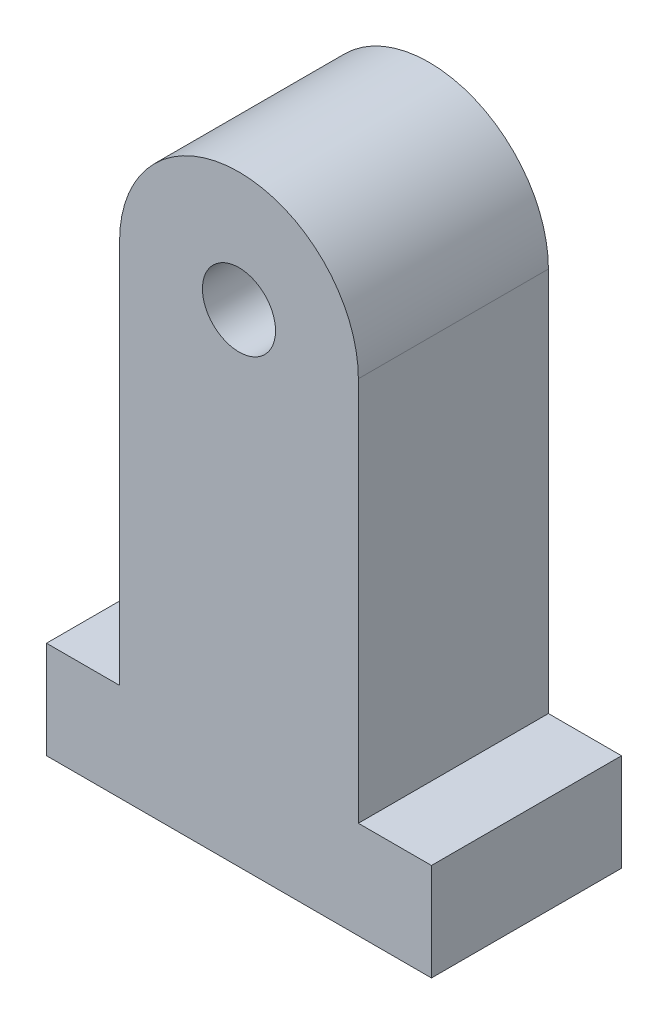
ISO-10303-21;
HEADER;
FILE_DESCRIPTION(('STEP AP214'),'2;1');
FILE_NAME('part.step','',(''),(''),'','','');
FILE_SCHEMA(('AUTOMOTIVE_DESIGN { 1 0 10303 214 1 1 1 1 }'));
ENDSEC;
DATA;
#1=APPLICATION_CONTEXT('core data for automotive mechanical design processes');
#2=APPLICATION_PROTOCOL_DEFINITION('international standard','automotive_design',2000,#1);
#3=PRODUCT_CONTEXT('',#1,'mechanical');
#4=PRODUCT('Part','Part','',(#3));
#5=PRODUCT_RELATED_PRODUCT_CATEGORY('part','',(#4));
#6=PRODUCT_DEFINITION_FORMATION('','',#4);
#7=PRODUCT_DEFINITION_CONTEXT('part definition',#1,'design');
#8=PRODUCT_DEFINITION('design','',#6,#7);
#9=PRODUCT_DEFINITION_SHAPE('','',#8);
#10=(LENGTH_UNIT() NAMED_UNIT(*) SI_UNIT(.MILLI.,.METRE.));
#11=(NAMED_UNIT(*) PLANE_ANGLE_UNIT() SI_UNIT($,.RADIAN.));
#12=(NAMED_UNIT(*) SI_UNIT($,.STERADIAN.) SOLID_ANGLE_UNIT());
#13=UNCERTAINTY_MEASURE_WITH_UNIT(LENGTH_MEASURE(1.E-05),#10,'distance_accuracy_value','');
#14=(GEOMETRIC_REPRESENTATION_CONTEXT(3) GLOBAL_UNCERTAINTY_ASSIGNED_CONTEXT((#13)) GLOBAL_UNIT_ASSIGNED_CONTEXT((#10,
#11,#12)) REPRESENTATION_CONTEXT('',''));
#15=CARTESIAN_POINT('',(0.,0.,0.));
#16=DIRECTION('',(0.,0.,1.));
#17=DIRECTION('',(1.,0.,0.));
#18=AXIS2_PLACEMENT_3D('',#15,#16,#17);
#19=CARTESIAN_POINT('',(0.,25.146,4.953));
#20=DIRECTION('',(0.,0.,-1.));
#21=DIRECTION('',(-1.,0.,0.));
#22=AXIS2_PLACEMENT_3D('',#19,#20,#21);
#23=PLANE('',#22);
#24=DIRECTION('',(0.,-1.,0.));
#25=VECTOR('',#24,1.);
#26=CARTESIAN_POINT('',(-10.033,0.,4.953));
#27=LINE('',#26,#25);
#28=CARTESIAN_POINT('',(-10.033,5.08,4.953));
#29=VERTEX_POINT('',#28);
#30=CARTESIAN_POINT('',(-10.033,0.,4.953));
#31=VERTEX_POINT('',#30);
#32=EDGE_CURVE('E149',#29,#31,#27,.T.);
#33=ORIENTED_EDGE('',*,*,#32,.T.);
#34=DIRECTION('',(1.,0.,0.));
#35=VECTOR('',#34,1.);
#36=CARTESIAN_POINT('',(10.033,0.,4.953));
#37=LINE('',#36,#35);
#38=CARTESIAN_POINT('',(10.033,0.,4.953));
#39=VERTEX_POINT('',#38);
#40=EDGE_CURVE('E97',#31,#39,#37,.T.);
#41=ORIENTED_EDGE('',*,*,#40,.T.);
#42=DIRECTION('',(0.,1.,0.));
#43=VECTOR('',#42,1.);
#44=CARTESIAN_POINT('',(10.033,0.,4.953));
#45=LINE('',#44,#43);
#46=CARTESIAN_POINT('',(10.033,5.08,4.953));
#47=VERTEX_POINT('',#46);
#48=EDGE_CURVE('E164',#39,#47,#45,.T.);
#49=ORIENTED_EDGE('',*,*,#48,.T.);
#50=DIRECTION('',(-1.,0.,0.));
#51=VECTOR('',#50,1.);
#52=CARTESIAN_POINT('',(10.033,5.08,4.953));
#53=LINE('',#52,#51);
#54=CARTESIAN_POINT('',(6.223,5.08,4.953));
#55=VERTEX_POINT('',#54);
#56=EDGE_CURVE('E177',#47,#55,#53,.T.);
#57=ORIENTED_EDGE('',*,*,#56,.T.);
#58=DIRECTION('',(0.,1.,0.));
#59=VECTOR('',#58,1.);
#60=CARTESIAN_POINT('',(6.223,5.08,4.953));
#61=LINE('',#60,#59);
#62=CARTESIAN_POINT('',(6.223,25.146,4.953));
#63=VERTEX_POINT('',#62);
#64=EDGE_CURVE('E116',#55,#63,#61,.T.);
#65=ORIENTED_EDGE('',*,*,#64,.T.);
#66=CARTESIAN_POINT('',(0.,25.146,4.953));
#67=DIRECTION('',(0.,0.,1.));
#68=DIRECTION('',(-1.,0.,0.));
#69=AXIS2_PLACEMENT_3D('',#66,#67,#68);
#70=CIRCLE('',#69,6.223);
#71=CARTESIAN_POINT('',(-6.223,25.146,4.953));
#72=VERTEX_POINT('',#71);
#73=EDGE_CURVE('E110',#63,#72,#70,.T.);
#74=ORIENTED_EDGE('',*,*,#73,.T.);
#75=DIRECTION('',(0.,-1.,0.));
#76=VECTOR('',#75,1.);
#77=CARTESIAN_POINT('',(-6.223,5.08,4.953));
#78=LINE('',#77,#76);
#79=CARTESIAN_POINT('',(-6.223,5.08,4.953));
#80=VERTEX_POINT('',#79);
#81=EDGE_CURVE('E114',#72,#80,#78,.T.);
#82=ORIENTED_EDGE('',*,*,#81,.T.);
#83=DIRECTION('',(-1.,0.,0.));
#84=VECTOR('',#83,1.);
#85=CARTESIAN_POINT('',(-10.033,5.08,4.953));
#86=LINE('',#85,#84);
#87=EDGE_CURVE('E54',#80,#29,#86,.T.);
#88=ORIENTED_EDGE('',*,*,#87,.T.);
#89=EDGE_LOOP('',(#33,#41,#49,#57,#65,#74,#82,#88));
#90=FACE_BOUND('',#89,.T.);
#91=CARTESIAN_POINT('',(0.,25.146,4.953));
#92=DIRECTION('',(0.,0.,1.));
#93=DIRECTION('',(1.,0.,0.));
#94=AXIS2_PLACEMENT_3D('',#91,#92,#93);
#95=CIRCLE('',#94,1.905);
#96=CARTESIAN_POINT('',(1.905,25.146,4.953));
#97=VERTEX_POINT('',#96);
#98=EDGE_CURVE('E138',#97,#97,#95,.T.);
#99=ORIENTED_EDGE('',*,*,#98,.F.);
#100=EDGE_LOOP('',(#99));
#101=FACE_BOUND('',#100,.T.);
#102=ADVANCED_FACE('F37',(#90,#101),#23,.F.);
#103=CARTESIAN_POINT('',(0.,25.146,-4.953));
#104=DIRECTION('',(0.,0.,-1.));
#105=DIRECTION('',(-1.,0.,0.));
#106=AXIS2_PLACEMENT_3D('',#103,#104,#105);
#107=PLANE('',#106);
#108=DIRECTION('',(0.,-1.,0.));
#109=VECTOR('',#108,1.);
#110=CARTESIAN_POINT('',(-10.033,0.,-4.953));
#111=LINE('',#110,#109);
#112=CARTESIAN_POINT('',(-10.033,5.08,-4.953));
#113=VERTEX_POINT('',#112);
#114=CARTESIAN_POINT('',(-10.033,0.,-4.953));
#115=VERTEX_POINT('',#114);
#116=EDGE_CURVE('E134',#113,#115,#111,.T.);
#117=ORIENTED_EDGE('',*,*,#116,.F.);
#118=DIRECTION('',(-1.,0.,0.));
#119=VECTOR('',#118,1.);
#120=CARTESIAN_POINT('',(-10.033,5.08,-4.953));
#121=LINE('',#120,#119);
#122=CARTESIAN_POINT('',(-6.223,5.08,-4.953));
#123=VERTEX_POINT('',#122);
#124=EDGE_CURVE('E89',#123,#113,#121,.T.);
#125=ORIENTED_EDGE('',*,*,#124,.F.);
#126=DIRECTION('',(0.,-1.,0.));
#127=VECTOR('',#126,1.);
#128=CARTESIAN_POINT('',(-6.223,5.08,-4.953));
#129=LINE('',#128,#127);
#130=CARTESIAN_POINT('',(-6.223,25.146,-4.953));
#131=VERTEX_POINT('',#130);
#132=EDGE_CURVE('E83',#131,#123,#129,.T.);
#133=ORIENTED_EDGE('',*,*,#132,.F.);
#134=CARTESIAN_POINT('',(0.,25.146,-4.953));
#135=DIRECTION('',(0.,0.,1.));
#136=DIRECTION('',(-1.,0.,0.));
#137=AXIS2_PLACEMENT_3D('',#134,#135,#136);
#138=CIRCLE('',#137,6.223);
#139=CARTESIAN_POINT('',(6.223,25.146,-4.953));
#140=VERTEX_POINT('',#139);
#141=EDGE_CURVE('E124',#140,#131,#138,.T.);
#142=ORIENTED_EDGE('',*,*,#141,.F.);
#143=DIRECTION('',(0.,1.,0.));
#144=VECTOR('',#143,1.);
#145=CARTESIAN_POINT('',(6.223,5.08,-4.953));
#146=LINE('',#145,#144);
#147=CARTESIAN_POINT('',(6.223,5.08,-4.953));
#148=VERTEX_POINT('',#147);
#149=EDGE_CURVE('E144',#148,#140,#146,.T.);
#150=ORIENTED_EDGE('',*,*,#149,.F.);
#151=DIRECTION('',(-1.,0.,0.));
#152=VECTOR('',#151,1.);
#153=CARTESIAN_POINT('',(10.033,5.08,-4.953));
#154=LINE('',#153,#152);
#155=CARTESIAN_POINT('',(10.033,5.08,-4.953));
#156=VERTEX_POINT('',#155);
#157=EDGE_CURVE('E142',#156,#148,#154,.T.);
#158=ORIENTED_EDGE('',*,*,#157,.F.);
#159=DIRECTION('',(0.,1.,0.));
#160=VECTOR('',#159,1.);
#161=CARTESIAN_POINT('',(10.033,0.,-4.953));
#162=LINE('',#161,#160);
#163=CARTESIAN_POINT('',(10.033,0.,-4.953));
#164=VERTEX_POINT('',#163);
#165=EDGE_CURVE('E140',#164,#156,#162,.T.);
#166=ORIENTED_EDGE('',*,*,#165,.F.);
#167=DIRECTION('',(1.,0.,0.));
#168=VECTOR('',#167,1.);
#169=CARTESIAN_POINT('',(10.033,0.,-4.953));
#170=LINE('',#169,#168);
#171=EDGE_CURVE('E137',#115,#164,#170,.T.);
#172=ORIENTED_EDGE('',*,*,#171,.F.);
#173=EDGE_LOOP('',(#117,#125,#133,#142,#150,#158,#166,#172));
#174=FACE_BOUND('',#173,.T.);
#175=CARTESIAN_POINT('',(0.,25.146,-4.953));
#176=DIRECTION('',(0.,0.,1.));
#177=DIRECTION('',(1.,0.,0.));
#178=AXIS2_PLACEMENT_3D('',#175,#176,#177);
#179=CIRCLE('',#178,1.905);
#180=CARTESIAN_POINT('',(1.905,25.146,-4.953));
#181=VERTEX_POINT('',#180);
#182=EDGE_CURVE('E183',#181,#181,#179,.T.);
#183=ORIENTED_EDGE('',*,*,#182,.T.);
#184=EDGE_LOOP('',(#183));
#185=FACE_BOUND('',#184,.T.);
#186=ADVANCED_FACE('F168',(#174,#185),#107,.T.);
#187=CARTESIAN_POINT('',(-10.033,0.,4.953));
#188=DIRECTION('',(1.,0.,0.));
#189=DIRECTION('',(0.,0.,-1.));
#190=AXIS2_PLACEMENT_3D('',#187,#188,#189);
#191=PLANE('',#190);
#192=ORIENTED_EDGE('',*,*,#116,.T.);
#193=DIRECTION('',(0.,0.,-1.));
#194=VECTOR('',#193,1.);
#195=CARTESIAN_POINT('',(-10.033,0.,4.953));
#196=LINE('',#195,#194);
#197=EDGE_CURVE('E11',#31,#115,#196,.T.);
#198=ORIENTED_EDGE('',*,*,#197,.F.);
#199=ORIENTED_EDGE('',*,*,#32,.F.);
#200=DIRECTION('',(0.,0.,-1.));
#201=VECTOR('',#200,1.);
#202=CARTESIAN_POINT('',(-10.033,5.08,4.953));
#203=LINE('',#202,#201);
#204=EDGE_CURVE('E130',#29,#113,#203,.T.);
#205=ORIENTED_EDGE('',*,*,#204,.T.);
#206=EDGE_LOOP('',(#192,#198,#199,#205));
#207=FACE_BOUND('',#206,.T.);
#208=ADVANCED_FACE('F39',(#207),#191,.F.);
#209=CARTESIAN_POINT('',(10.033,0.,4.953));
#210=DIRECTION('',(0.,1.,0.));
#211=DIRECTION('',(0.,0.,1.));
#212=AXIS2_PLACEMENT_3D('',#209,#210,#211);
#213=PLANE('',#212);
#214=ORIENTED_EDGE('',*,*,#171,.T.);
#215=DIRECTION('',(0.,0.,-1.));
#216=VECTOR('',#215,1.);
#217=CARTESIAN_POINT('',(10.033,0.,4.953));
#218=LINE('',#217,#216);
#219=EDGE_CURVE('E46',#39,#164,#218,.T.);
#220=ORIENTED_EDGE('',*,*,#219,.F.);
#221=ORIENTED_EDGE('',*,*,#40,.F.);
#222=ORIENTED_EDGE('',*,*,#197,.T.);
#223=EDGE_LOOP('',(#214,#220,#221,#222));
#224=FACE_BOUND('',#223,.T.);
#225=ADVANCED_FACE('F211',(#224),#213,.F.);
#226=CARTESIAN_POINT('',(10.033,0.,4.953));
#227=DIRECTION('',(-1.,0.,0.));
#228=DIRECTION('',(0.,0.,1.));
#229=AXIS2_PLACEMENT_3D('',#226,#227,#228);
#230=PLANE('',#229);
#231=ORIENTED_EDGE('',*,*,#165,.T.);
#232=DIRECTION('',(0.,0.,-1.));
#233=VECTOR('',#232,1.);
#234=CARTESIAN_POINT('',(10.033,5.08,4.953));
#235=LINE('',#234,#233);
#236=EDGE_CURVE('E156',#47,#156,#235,.T.);
#237=ORIENTED_EDGE('',*,*,#236,.F.);
#238=ORIENTED_EDGE('',*,*,#48,.F.);
#239=ORIENTED_EDGE('',*,*,#219,.T.);
#240=EDGE_LOOP('',(#231,#237,#238,#239));
#241=FACE_BOUND('',#240,.T.);
#242=ADVANCED_FACE('F162',(#241),#230,.F.);
#243=CARTESIAN_POINT('',(10.033,5.08,4.953));
#244=DIRECTION('',(0.,-1.,0.));
#245=DIRECTION('',(0.,0.,-1.));
#246=AXIS2_PLACEMENT_3D('',#243,#244,#245);
#247=PLANE('',#246);
#248=ORIENTED_EDGE('',*,*,#157,.T.);
#249=DIRECTION('',(0.,0.,-1.));
#250=VECTOR('',#249,1.);
#251=CARTESIAN_POINT('',(6.223,5.08,4.953));
#252=LINE('',#251,#250);
#253=EDGE_CURVE('E153',#55,#148,#252,.T.);
#254=ORIENTED_EDGE('',*,*,#253,.F.);
#255=ORIENTED_EDGE('',*,*,#56,.F.);
#256=ORIENTED_EDGE('',*,*,#236,.T.);
#257=EDGE_LOOP('',(#248,#254,#255,#256));
#258=FACE_BOUND('',#257,.T.);
#259=ADVANCED_FACE('F173',(#258),#247,.F.);
#260=CARTESIAN_POINT('',(6.223,5.08,4.953));
#261=DIRECTION('',(-1.,0.,0.));
#262=DIRECTION('',(0.,0.,1.));
#263=AXIS2_PLACEMENT_3D('',#260,#261,#262);
#264=PLANE('',#263);
#265=ORIENTED_EDGE('',*,*,#149,.T.);
#266=DIRECTION('',(0.,0.,-1.));
#267=VECTOR('',#266,1.);
#268=CARTESIAN_POINT('',(6.223,25.146,4.953));
#269=LINE('',#268,#267);
#270=EDGE_CURVE('E125',#63,#140,#269,.T.);
#271=ORIENTED_EDGE('',*,*,#270,.F.);
#272=ORIENTED_EDGE('',*,*,#64,.F.);
#273=ORIENTED_EDGE('',*,*,#253,.T.);
#274=EDGE_LOOP('',(#265,#271,#272,#273));
#275=FACE_BOUND('',#274,.T.);
#276=ADVANCED_FACE('F176',(#275),#264,.F.);
#277=CARTESIAN_POINT('',(0.,25.146,4.953));
#278=DIRECTION('',(0.,0.,-1.));
#279=DIRECTION('',(-1.,0.,0.));
#280=AXIS2_PLACEMENT_3D('',#277,#278,#279);
#281=CYLINDRICAL_SURFACE('',#280,6.223);
#282=ORIENTED_EDGE('',*,*,#141,.T.);
#283=DIRECTION('',(0.,0.,-1.));
#284=VECTOR('',#283,1.);
#285=CARTESIAN_POINT('',(-6.223,25.146,4.953));
#286=LINE('',#285,#284);
#287=EDGE_CURVE('E121',#72,#131,#286,.T.);
#288=ORIENTED_EDGE('',*,*,#287,.F.);
#289=ORIENTED_EDGE('',*,*,#73,.F.);
#290=ORIENTED_EDGE('',*,*,#270,.T.);
#291=EDGE_LOOP('',(#282,#288,#289,#290));
#292=FACE_BOUND('',#291,.T.);
#293=ADVANCED_FACE('F122',(#292),#281,.T.);
#294=CARTESIAN_POINT('',(-6.223,5.08,4.953));
#295=DIRECTION('',(1.,0.,0.));
#296=DIRECTION('',(0.,0.,-1.));
#297=AXIS2_PLACEMENT_3D('',#294,#295,#296);
#298=PLANE('',#297);
#299=ORIENTED_EDGE('',*,*,#132,.T.);
#300=DIRECTION('',(0.,0.,-1.));
#301=VECTOR('',#300,1.);
#302=CARTESIAN_POINT('',(-6.223,5.08,4.953));
#303=LINE('',#302,#301);
#304=EDGE_CURVE('E126',#80,#123,#303,.T.);
#305=ORIENTED_EDGE('',*,*,#304,.F.);
#306=ORIENTED_EDGE('',*,*,#81,.F.);
#307=ORIENTED_EDGE('',*,*,#287,.T.);
#308=EDGE_LOOP('',(#299,#305,#306,#307));
#309=FACE_BOUND('',#308,.T.);
#310=ADVANCED_FACE('F128',(#309),#298,.F.);
#311=CARTESIAN_POINT('',(-10.033,5.08,4.953));
#312=DIRECTION('',(0.,-1.,0.));
#313=DIRECTION('',(0.,0.,-1.));
#314=AXIS2_PLACEMENT_3D('',#311,#312,#313);
#315=PLANE('',#314);
#316=ORIENTED_EDGE('',*,*,#124,.T.);
#317=ORIENTED_EDGE('',*,*,#204,.F.);
#318=ORIENTED_EDGE('',*,*,#87,.F.);
#319=ORIENTED_EDGE('',*,*,#304,.T.);
#320=EDGE_LOOP('',(#316,#317,#318,#319));
#321=FACE_BOUND('',#320,.T.);
#322=ADVANCED_FACE('F199',(#321),#315,.F.);
#323=CARTESIAN_POINT('',(0.,25.146,4.953));
#324=DIRECTION('',(0.,0.,-1.));
#325=DIRECTION('',(-1.,0.,0.));
#326=AXIS2_PLACEMENT_3D('',#323,#324,#325);
#327=CYLINDRICAL_SURFACE('',#326,1.905);
#328=ORIENTED_EDGE('',*,*,#98,.T.);
#329=EDGE_LOOP('',(#328));
#330=FACE_BOUND('',#329,.T.);
#331=ORIENTED_EDGE('',*,*,#182,.F.);
#332=EDGE_LOOP('',(#331));
#333=FACE_BOUND('',#332,.T.);
#334=ADVANCED_FACE('F189',(#330,#333),#327,.F.);
#335=CLOSED_SHELL('',(#102,#186,#208,#225,#242,#259,#276,#293,#310,#322,#334));
#336=MANIFOLD_SOLID_BREP('B2',#335);
#337=ADVANCED_BREP_SHAPE_REPRESENTATION('',(#18,#336),#14);
#338=SHAPE_DEFINITION_REPRESENTATION(#9,#337);
ENDSEC;
END-ISO-10303-21;
